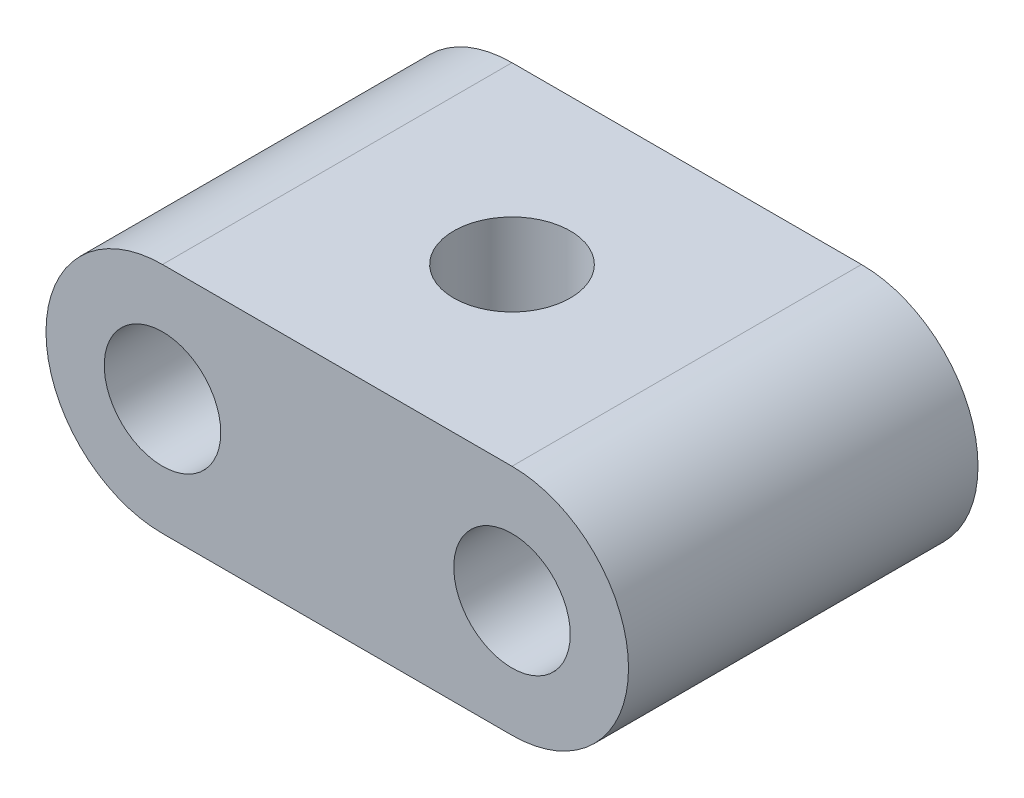
ISO-10303-21;
HEADER;
FILE_DESCRIPTION(('STEP AP214'),'2;1');
FILE_NAME('part.step','',(''),(''),'','','');
FILE_SCHEMA(('AUTOMOTIVE_DESIGN { 1 0 10303 214 1 1 1 1 }'));
ENDSEC;
DATA;
#1=APPLICATION_CONTEXT('core data for automotive mechanical design processes');
#2=APPLICATION_PROTOCOL_DEFINITION('international standard','automotive_design',2000,#1);
#3=PRODUCT_CONTEXT('',#1,'mechanical');
#4=PRODUCT('Part','Part','',(#3));
#5=PRODUCT_RELATED_PRODUCT_CATEGORY('part','',(#4));
#6=PRODUCT_DEFINITION_FORMATION('','',#4);
#7=PRODUCT_DEFINITION_CONTEXT('part definition',#1,'design');
#8=PRODUCT_DEFINITION('design','',#6,#7);
#9=PRODUCT_DEFINITION_SHAPE('','',#8);
#10=(LENGTH_UNIT() NAMED_UNIT(*) SI_UNIT(.MILLI.,.METRE.));
#11=(NAMED_UNIT(*) PLANE_ANGLE_UNIT() SI_UNIT($,.RADIAN.));
#12=(NAMED_UNIT(*) SI_UNIT($,.STERADIAN.) SOLID_ANGLE_UNIT());
#13=UNCERTAINTY_MEASURE_WITH_UNIT(LENGTH_MEASURE(1.E-05),#10,'distance_accuracy_value','');
#14=(GEOMETRIC_REPRESENTATION_CONTEXT(3) GLOBAL_UNCERTAINTY_ASSIGNED_CONTEXT((#13)) GLOBAL_UNIT_ASSIGNED_CONTEXT((#10,
#11,#12)) REPRESENTATION_CONTEXT('',''));
#15=CARTESIAN_POINT('',(0.,0.,0.));
#16=DIRECTION('',(0.,0.,1.));
#17=DIRECTION('',(1.,0.,0.));
#18=AXIS2_PLACEMENT_3D('',#15,#16,#17);
#19=CARTESIAN_POINT('',(-37.4994057523175,24.0080817684811,30.));
#20=DIRECTION('',(0.,0.,1.));
#21=DIRECTION('',(1.,0.,0.));
#22=AXIS2_PLACEMENT_3D('',#19,#20,#21);
#23=PLANE('',#22);
#24=CARTESIAN_POINT('',(-37.4994057523175,24.0080817684811,30.));
#25=DIRECTION('',(0.,0.,1.));
#26=DIRECTION('',(1.,0.,0.));
#27=AXIS2_PLACEMENT_3D('',#24,#25,#26);
#28=CIRCLE('',#27,5.);
#29=CARTESIAN_POINT('',(-32.4994057523175,24.0080817684811,30.));
#30=VERTEX_POINT('',#29);
#31=EDGE_CURVE('E100',#30,#30,#28,.T.);
#32=ORIENTED_EDGE('',*,*,#31,.F.);
#33=EDGE_LOOP('',(#32));
#34=FACE_BOUND('',#33,.T.);
#35=CARTESIAN_POINT('',(-37.4994057523175,24.0080817684811,30.));
#36=DIRECTION('',(0.,0.,1.));
#37=DIRECTION('',(1.,0.,0.));
#38=AXIS2_PLACEMENT_3D('',#35,#36,#37);
#39=CIRCLE('',#38,10.);
#40=CARTESIAN_POINT('',(-37.4994057523175,34.0080817684811,30.));
#41=VERTEX_POINT('',#40);
#42=CARTESIAN_POINT('',(-37.4994057523175,14.0080817684811,30.));
#43=VERTEX_POINT('',#42);
#44=EDGE_CURVE('E85',#41,#43,#39,.T.);
#45=ORIENTED_EDGE('',*,*,#44,.T.);
#46=DIRECTION('',(1.,0.,0.));
#47=VECTOR('',#46,1.);
#48=CARTESIAN_POINT('',(-37.4994057523175,14.0080817684811,30.));
#49=LINE('',#48,#47);
#50=CARTESIAN_POINT('',(-7.49940575231753,14.0080817684811,30.));
#51=VERTEX_POINT('',#50);
#52=EDGE_CURVE('E80',#43,#51,#49,.T.);
#53=ORIENTED_EDGE('',*,*,#52,.T.);
#54=CARTESIAN_POINT('',(-7.49940575231753,24.0080817684811,30.));
#55=DIRECTION('',(0.,0.,1.));
#56=DIRECTION('',(1.,0.,0.));
#57=AXIS2_PLACEMENT_3D('',#54,#55,#56);
#58=CIRCLE('',#57,10.);
#59=CARTESIAN_POINT('',(-7.49940575231753,34.0080817684811,30.));
#60=VERTEX_POINT('',#59);
#61=EDGE_CURVE('E83',#51,#60,#58,.T.);
#62=ORIENTED_EDGE('',*,*,#61,.T.);
#63=DIRECTION('',(-1.,0.,0.));
#64=VECTOR('',#63,1.);
#65=CARTESIAN_POINT('',(-37.4994057523175,34.0080817684811,30.));
#66=LINE('',#65,#64);
#67=EDGE_CURVE('E50',#60,#41,#66,.T.);
#68=ORIENTED_EDGE('',*,*,#67,.T.);
#69=EDGE_LOOP('',(#45,#53,#62,#68));
#70=FACE_BOUND('',#69,.T.);
#71=CARTESIAN_POINT('',(-7.49940575231753,24.0080817684811,30.));
#72=DIRECTION('',(0.,0.,1.));
#73=DIRECTION('',(1.,0.,0.));
#74=AXIS2_PLACEMENT_3D('',#71,#72,#73);
#75=CIRCLE('',#74,5.);
#76=CARTESIAN_POINT('',(-2.49940575231753,24.0080817684811,30.));
#77=VERTEX_POINT('',#76);
#78=EDGE_CURVE('E115',#77,#77,#75,.T.);
#79=ORIENTED_EDGE('',*,*,#78,.F.);
#80=EDGE_LOOP('',(#79));
#81=FACE_BOUND('',#80,.T.);
#82=ADVANCED_FACE('F33',(#34,#70,#81),#23,.T.);
#83=CARTESIAN_POINT('',(-37.4994057523175,24.0080817684811,0.));
#84=DIRECTION('',(0.,0.,1.));
#85=DIRECTION('',(1.,0.,0.));
#86=AXIS2_PLACEMENT_3D('',#83,#84,#85);
#87=PLANE('',#86);
#88=CARTESIAN_POINT('',(-37.4994057523175,24.0080817684811,0.));
#89=DIRECTION('',(0.,0.,1.));
#90=DIRECTION('',(1.,0.,0.));
#91=AXIS2_PLACEMENT_3D('',#88,#89,#90);
#92=CIRCLE('',#91,10.);
#93=CARTESIAN_POINT('',(-37.4994057523175,34.0080817684811,0.));
#94=VERTEX_POINT('',#93);
#95=CARTESIAN_POINT('',(-37.4994057523175,14.0080817684811,0.));
#96=VERTEX_POINT('',#95);
#97=EDGE_CURVE('E97',#94,#96,#92,.T.);
#98=ORIENTED_EDGE('',*,*,#97,.F.);
#99=DIRECTION('',(-1.,0.,0.));
#100=VECTOR('',#99,1.);
#101=CARTESIAN_POINT('',(-37.4994057523175,34.0080817684811,0.));
#102=LINE('',#101,#100);
#103=CARTESIAN_POINT('',(-7.49940575231753,34.0080817684811,0.));
#104=VERTEX_POINT('',#103);
#105=EDGE_CURVE('E73',#104,#94,#102,.T.);
#106=ORIENTED_EDGE('',*,*,#105,.F.);
#107=CARTESIAN_POINT('',(-7.49940575231753,24.0080817684811,0.));
#108=DIRECTION('',(0.,0.,1.));
#109=DIRECTION('',(1.,0.,0.));
#110=AXIS2_PLACEMENT_3D('',#107,#108,#109);
#111=CIRCLE('',#110,10.);
#112=CARTESIAN_POINT('',(-7.49940575231753,14.0080817684811,0.));
#113=VERTEX_POINT('',#112);
#114=EDGE_CURVE('E67',#113,#104,#111,.T.);
#115=ORIENTED_EDGE('',*,*,#114,.F.);
#116=DIRECTION('',(1.,0.,0.));
#117=VECTOR('',#116,1.);
#118=CARTESIAN_POINT('',(-37.4994057523175,14.0080817684811,0.));
#119=LINE('',#118,#117);
#120=EDGE_CURVE('E89',#96,#113,#119,.T.);
#121=ORIENTED_EDGE('',*,*,#120,.F.);
#122=EDGE_LOOP('',(#98,#106,#115,#121));
#123=FACE_BOUND('',#122,.T.);
#124=CARTESIAN_POINT('',(-37.4994057523175,24.0080817684811,0.));
#125=DIRECTION('',(0.,0.,1.));
#126=DIRECTION('',(1.,0.,0.));
#127=AXIS2_PLACEMENT_3D('',#124,#125,#126);
#128=CIRCLE('',#127,5.);
#129=CARTESIAN_POINT('',(-32.4994057523175,24.0080817684811,0.));
#130=VERTEX_POINT('',#129);
#131=EDGE_CURVE('E112',#130,#130,#128,.T.);
#132=ORIENTED_EDGE('',*,*,#131,.T.);
#133=EDGE_LOOP('',(#132));
#134=FACE_BOUND('',#133,.T.);
#135=CARTESIAN_POINT('',(-7.49940575231753,24.0080817684811,0.));
#136=DIRECTION('',(0.,0.,1.));
#137=DIRECTION('',(1.,0.,0.));
#138=AXIS2_PLACEMENT_3D('',#135,#136,#137);
#139=CIRCLE('',#138,5.);
#140=CARTESIAN_POINT('',(-2.49940575231753,24.0080817684811,0.));
#141=VERTEX_POINT('',#140);
#142=EDGE_CURVE('E118',#141,#141,#139,.T.);
#143=ORIENTED_EDGE('',*,*,#142,.T.);
#144=EDGE_LOOP('',(#143));
#145=FACE_BOUND('',#144,.T.);
#146=ADVANCED_FACE('F108',(#123,#134,#145),#87,.F.);
#147=CARTESIAN_POINT('',(-37.4994057523175,24.0080817684811,30.));
#148=DIRECTION('',(0.,0.,-1.));
#149=DIRECTION('',(-1.,0.,0.));
#150=AXIS2_PLACEMENT_3D('',#147,#148,#149);
#151=CYLINDRICAL_SURFACE('',#150,10.);
#152=ORIENTED_EDGE('',*,*,#97,.T.);
#153=DIRECTION('',(0.,0.,-1.));
#154=VECTOR('',#153,1.);
#155=CARTESIAN_POINT('',(-37.4994057523175,14.0080817684811,30.));
#156=LINE('',#155,#154);
#157=EDGE_CURVE('E11',#43,#96,#156,.T.);
#158=ORIENTED_EDGE('',*,*,#157,.F.);
#159=ORIENTED_EDGE('',*,*,#44,.F.);
#160=DIRECTION('',(0.,0.,-1.));
#161=VECTOR('',#160,1.);
#162=CARTESIAN_POINT('',(-37.4994057523175,34.0080817684811,30.));
#163=LINE('',#162,#161);
#164=EDGE_CURVE('E93',#41,#94,#163,.T.);
#165=ORIENTED_EDGE('',*,*,#164,.T.);
#166=EDGE_LOOP('',(#152,#158,#159,#165));
#167=FACE_BOUND('',#166,.T.);
#168=ADVANCED_FACE('F35',(#167),#151,.T.);
#169=CARTESIAN_POINT('',(-37.4994057523175,14.0080817684811,30.));
#170=DIRECTION('',(0.,1.,0.));
#171=DIRECTION('',(0.,0.,1.));
#172=AXIS2_PLACEMENT_3D('',#169,#170,#171);
#173=PLANE('',#172);
#174=CARTESIAN_POINT('',(-22.4994057523175,14.0080817684811,15.));
#175=DIRECTION('',(0.,1.,0.));
#176=DIRECTION('',(0.,0.,1.));
#177=AXIS2_PLACEMENT_3D('',#174,#175,#176);
#178=CIRCLE('',#177,5.);
#179=CARTESIAN_POINT('',(-22.4994057523175,14.0080817684811,20.));
#180=VERTEX_POINT('',#179);
#181=EDGE_CURVE('E121',#180,#180,#178,.T.);
#182=ORIENTED_EDGE('',*,*,#181,.T.);
#183=EDGE_LOOP('',(#182));
#184=FACE_BOUND('',#183,.T.);
#185=ORIENTED_EDGE('',*,*,#120,.T.);
#186=DIRECTION('',(0.,0.,-1.));
#187=VECTOR('',#186,1.);
#188=CARTESIAN_POINT('',(-7.49940575231753,14.0080817684811,30.));
#189=LINE('',#188,#187);
#190=EDGE_CURVE('E42',#51,#113,#189,.T.);
#191=ORIENTED_EDGE('',*,*,#190,.F.);
#192=ORIENTED_EDGE('',*,*,#52,.F.);
#193=ORIENTED_EDGE('',*,*,#157,.T.);
#194=EDGE_LOOP('',(#185,#191,#192,#193));
#195=FACE_BOUND('',#194,.T.);
#196=ADVANCED_FACE('F88',(#184,#195),#173,.F.);
#197=CARTESIAN_POINT('',(-7.49940575231753,24.0080817684811,30.));
#198=DIRECTION('',(0.,0.,-1.));
#199=DIRECTION('',(-1.,0.,0.));
#200=AXIS2_PLACEMENT_3D('',#197,#198,#199);
#201=CYLINDRICAL_SURFACE('',#200,10.);
#202=ORIENTED_EDGE('',*,*,#114,.T.);
#203=DIRECTION('',(0.,0.,-1.));
#204=VECTOR('',#203,1.);
#205=CARTESIAN_POINT('',(-7.49940575231753,34.0080817684811,30.));
#206=LINE('',#205,#204);
#207=EDGE_CURVE('E90',#60,#104,#206,.T.);
#208=ORIENTED_EDGE('',*,*,#207,.F.);
#209=ORIENTED_EDGE('',*,*,#61,.F.);
#210=ORIENTED_EDGE('',*,*,#190,.T.);
#211=EDGE_LOOP('',(#202,#208,#209,#210));
#212=FACE_BOUND('',#211,.T.);
#213=ADVANCED_FACE('F91',(#212),#201,.T.);
#214=CARTESIAN_POINT('',(-37.4994057523175,34.0080817684811,30.));
#215=DIRECTION('',(0.,-1.,0.));
#216=DIRECTION('',(0.,0.,-1.));
#217=AXIS2_PLACEMENT_3D('',#214,#215,#216);
#218=PLANE('',#217);
#219=CARTESIAN_POINT('',(-22.4994057523175,34.0080817684811,15.));
#220=DIRECTION('',(0.,1.,0.));
#221=DIRECTION('',(0.,0.,1.));
#222=AXIS2_PLACEMENT_3D('',#219,#220,#221);
#223=CIRCLE('',#222,5.);
#224=CARTESIAN_POINT('',(-22.4994057523175,34.0080817684811,20.));
#225=VERTEX_POINT('',#224);
#226=EDGE_CURVE('E124',#225,#225,#223,.T.);
#227=ORIENTED_EDGE('',*,*,#226,.F.);
#228=EDGE_LOOP('',(#227));
#229=FACE_BOUND('',#228,.T.);
#230=ORIENTED_EDGE('',*,*,#105,.T.);
#231=ORIENTED_EDGE('',*,*,#164,.F.);
#232=ORIENTED_EDGE('',*,*,#67,.F.);
#233=ORIENTED_EDGE('',*,*,#207,.T.);
#234=EDGE_LOOP('',(#230,#231,#232,#233));
#235=FACE_BOUND('',#234,.T.);
#236=ADVANCED_FACE('F105',(#229,#235),#218,.F.);
#237=CARTESIAN_POINT('',(-37.4994057523175,24.0080817684811,30.));
#238=DIRECTION('',(0.,0.,-1.));
#239=DIRECTION('',(-1.,0.,0.));
#240=AXIS2_PLACEMENT_3D('',#237,#238,#239);
#241=CYLINDRICAL_SURFACE('',#240,5.);
#242=ORIENTED_EDGE('',*,*,#31,.T.);
#243=EDGE_LOOP('',(#242));
#244=FACE_BOUND('',#243,.T.);
#245=ORIENTED_EDGE('',*,*,#131,.F.);
#246=EDGE_LOOP('',(#245));
#247=FACE_BOUND('',#246,.T.);
#248=ADVANCED_FACE('F139',(#244,#247),#241,.F.);
#249=CARTESIAN_POINT('',(-7.49940575231753,24.0080817684811,30.));
#250=DIRECTION('',(0.,0.,-1.));
#251=DIRECTION('',(-1.,0.,0.));
#252=AXIS2_PLACEMENT_3D('',#249,#250,#251);
#253=CYLINDRICAL_SURFACE('',#252,5.);
#254=ORIENTED_EDGE('',*,*,#78,.T.);
#255=EDGE_LOOP('',(#254));
#256=FACE_BOUND('',#255,.T.);
#257=ORIENTED_EDGE('',*,*,#142,.F.);
#258=EDGE_LOOP('',(#257));
#259=FACE_BOUND('',#258,.T.);
#260=ADVANCED_FACE('F134',(#256,#259),#253,.F.);
#261=CARTESIAN_POINT('',(-22.4994057523175,14.0080817684811,15.));
#262=DIRECTION('',(0.,1.,0.));
#263=DIRECTION('',(0.,0.,1.));
#264=AXIS2_PLACEMENT_3D('',#261,#262,#263);
#265=CYLINDRICAL_SURFACE('',#264,5.);
#266=ORIENTED_EDGE('',*,*,#181,.F.);
#267=EDGE_LOOP('',(#266));
#268=FACE_BOUND('',#267,.T.);
#269=ORIENTED_EDGE('',*,*,#226,.T.);
#270=EDGE_LOOP('',(#269));
#271=FACE_BOUND('',#270,.T.);
#272=ADVANCED_FACE('F131',(#268,#271),#265,.F.);
#273=CLOSED_SHELL('',(#82,#146,#168,#196,#213,#236,#248,#260,#272));
#274=MANIFOLD_SOLID_BREP('B2',#273);
#275=ADVANCED_BREP_SHAPE_REPRESENTATION('',(#18,#274),#14);
#276=SHAPE_DEFINITION_REPRESENTATION(#9,#275);
ENDSEC;
END-ISO-10303-21;
